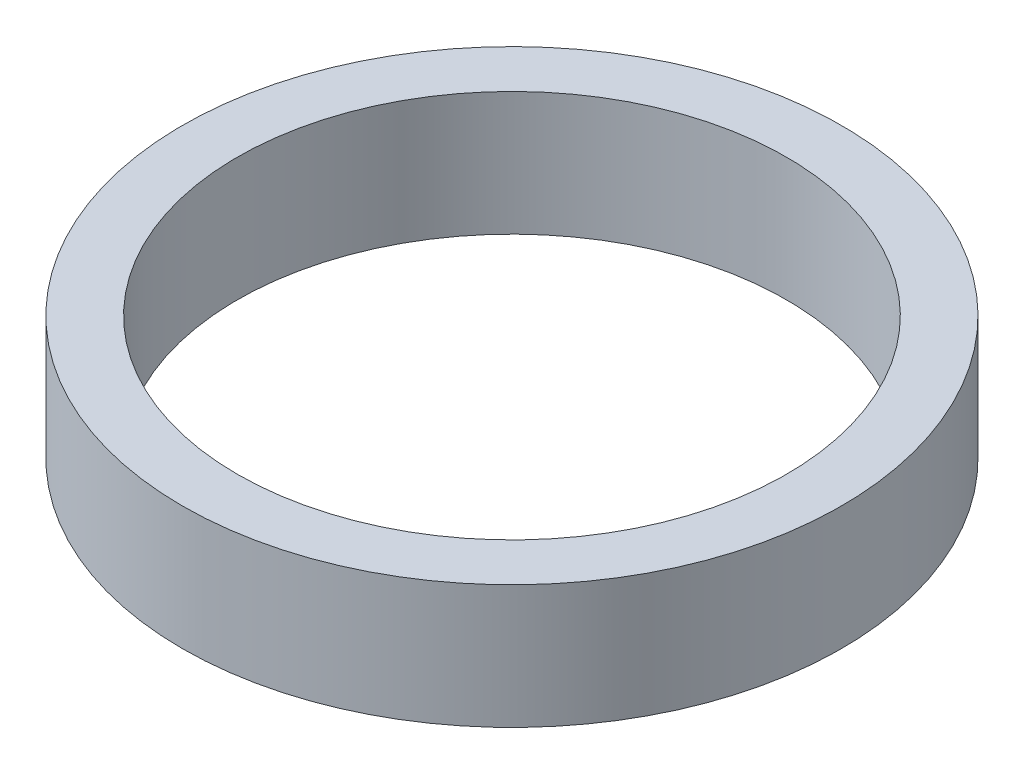
ISO-10303-21;
HEADER;
FILE_DESCRIPTION(('STEP AP214'),'2;1');
FILE_NAME('part.step','',(''),(''),'','','');
FILE_SCHEMA(('AUTOMOTIVE_DESIGN { 1 0 10303 214 1 1 1 1 }'));
ENDSEC;
DATA;
#1=APPLICATION_CONTEXT('core data for automotive mechanical design processes');
#2=APPLICATION_PROTOCOL_DEFINITION('international standard','automotive_design',2000,#1);
#3=PRODUCT_CONTEXT('',#1,'mechanical');
#4=PRODUCT('Part','Part','',(#3));
#5=PRODUCT_RELATED_PRODUCT_CATEGORY('part','',(#4));
#6=PRODUCT_DEFINITION_FORMATION('','',#4);
#7=PRODUCT_DEFINITION_CONTEXT('part definition',#1,'design');
#8=PRODUCT_DEFINITION('design','',#6,#7);
#9=PRODUCT_DEFINITION_SHAPE('','',#8);
#10=(LENGTH_UNIT() NAMED_UNIT(*) SI_UNIT(.MILLI.,.METRE.));
#11=(NAMED_UNIT(*) PLANE_ANGLE_UNIT() SI_UNIT($,.RADIAN.));
#12=(NAMED_UNIT(*) SI_UNIT($,.STERADIAN.) SOLID_ANGLE_UNIT());
#13=UNCERTAINTY_MEASURE_WITH_UNIT(LENGTH_MEASURE(1.E-05),#10,'distance_accuracy_value','');
#14=(GEOMETRIC_REPRESENTATION_CONTEXT(3) GLOBAL_UNCERTAINTY_ASSIGNED_CONTEXT((#13)) GLOBAL_UNIT_ASSIGNED_CONTEXT((#10,
#11,#12)) REPRESENTATION_CONTEXT('',''));
#15=CARTESIAN_POINT('',(0.,0.,0.));
#16=DIRECTION('',(0.,0.,1.));
#17=DIRECTION('',(1.,0.,0.));
#18=AXIS2_PLACEMENT_3D('',#15,#16,#17);
#19=CARTESIAN_POINT('',(0.,9.,0.));
#20=DIRECTION('',(0.,1.,0.));
#21=DIRECTION('',(0.,0.,1.));
#22=AXIS2_PLACEMENT_3D('',#19,#20,#21);
#23=PLANE('',#22);
#24=CARTESIAN_POINT('',(0.,9.,0.));
#25=DIRECTION('',(0.,1.,0.));
#26=DIRECTION('',(0.,0.,1.));
#27=AXIS2_PLACEMENT_3D('',#24,#25,#26);
#28=CIRCLE('',#27,24.);
#29=CARTESIAN_POINT('',(0.,9.,24.));
#30=VERTEX_POINT('',#29);
#31=EDGE_CURVE('E10',#30,#30,#28,.T.);
#32=ORIENTED_EDGE('',*,*,#31,.T.);
#33=EDGE_LOOP('',(#32));
#34=FACE_BOUND('',#33,.T.);
#35=CARTESIAN_POINT('',(0.,9.,0.));
#36=DIRECTION('',(0.,1.,0.));
#37=DIRECTION('',(0.,0.,1.));
#38=AXIS2_PLACEMENT_3D('',#35,#36,#37);
#39=CIRCLE('',#38,20.);
#40=CARTESIAN_POINT('',(0.,9.,20.));
#41=VERTEX_POINT('',#40);
#42=EDGE_CURVE('E45',#41,#41,#39,.T.);
#43=ORIENTED_EDGE('',*,*,#42,.F.);
#44=EDGE_LOOP('',(#43));
#45=FACE_BOUND('',#44,.T.);
#46=ADVANCED_FACE('F34',(#34,#45),#23,.T.);
#47=CARTESIAN_POINT('',(0.,0.,0.));
#48=DIRECTION('',(0.,1.,0.));
#49=DIRECTION('',(0.,0.,1.));
#50=AXIS2_PLACEMENT_3D('',#47,#48,#49);
#51=PLANE('',#50);
#52=CARTESIAN_POINT('',(0.,0.,0.));
#53=DIRECTION('',(0.,1.,0.));
#54=DIRECTION('',(0.,0.,1.));
#55=AXIS2_PLACEMENT_3D('',#52,#53,#54);
#56=CIRCLE('',#55,24.);
#57=CARTESIAN_POINT('',(0.,0.,24.));
#58=VERTEX_POINT('',#57);
#59=EDGE_CURVE('E38',#58,#58,#56,.T.);
#60=ORIENTED_EDGE('',*,*,#59,.F.);
#61=EDGE_LOOP('',(#60));
#62=FACE_BOUND('',#61,.T.);
#63=CARTESIAN_POINT('',(0.,0.,0.));
#64=DIRECTION('',(0.,1.,0.));
#65=DIRECTION('',(0.,0.,1.));
#66=AXIS2_PLACEMENT_3D('',#63,#64,#65);
#67=CIRCLE('',#66,20.);
#68=CARTESIAN_POINT('',(0.,0.,20.));
#69=VERTEX_POINT('',#68);
#70=EDGE_CURVE('E47',#69,#69,#67,.T.);
#71=ORIENTED_EDGE('',*,*,#70,.T.);
#72=EDGE_LOOP('',(#71));
#73=FACE_BOUND('',#72,.T.);
#74=ADVANCED_FACE('F57',(#62,#73),#51,.F.);
#75=CARTESIAN_POINT('',(0.,9.,0.));
#76=DIRECTION('',(0.,-1.,0.));
#77=DIRECTION('',(0.,0.,-1.));
#78=AXIS2_PLACEMENT_3D('',#75,#76,#77);
#79=CYLINDRICAL_SURFACE('',#78,24.);
#80=ORIENTED_EDGE('',*,*,#31,.F.);
#81=EDGE_LOOP('',(#80));
#82=FACE_BOUND('',#81,.T.);
#83=ORIENTED_EDGE('',*,*,#59,.T.);
#84=EDGE_LOOP('',(#83));
#85=FACE_BOUND('',#84,.T.);
#86=ADVANCED_FACE('F36',(#82,#85),#79,.T.);
#87=CARTESIAN_POINT('',(0.,9.,0.));
#88=DIRECTION('',(0.,-1.,0.));
#89=DIRECTION('',(0.,0.,-1.));
#90=AXIS2_PLACEMENT_3D('',#87,#88,#89);
#91=CYLINDRICAL_SURFACE('',#90,20.);
#92=ORIENTED_EDGE('',*,*,#42,.T.);
#93=EDGE_LOOP('',(#92));
#94=FACE_BOUND('',#93,.T.);
#95=ORIENTED_EDGE('',*,*,#70,.F.);
#96=EDGE_LOOP('',(#95));
#97=FACE_BOUND('',#96,.T.);
#98=ADVANCED_FACE('F53',(#94,#97),#91,.F.);
#99=CLOSED_SHELL('',(#46,#74,#86,#98));
#100=MANIFOLD_SOLID_BREP('B2',#99);
#101=ADVANCED_BREP_SHAPE_REPRESENTATION('',(#18,#100),#14);
#102=SHAPE_DEFINITION_REPRESENTATION(#9,#101);
ENDSEC;
END-ISO-10303-21;
